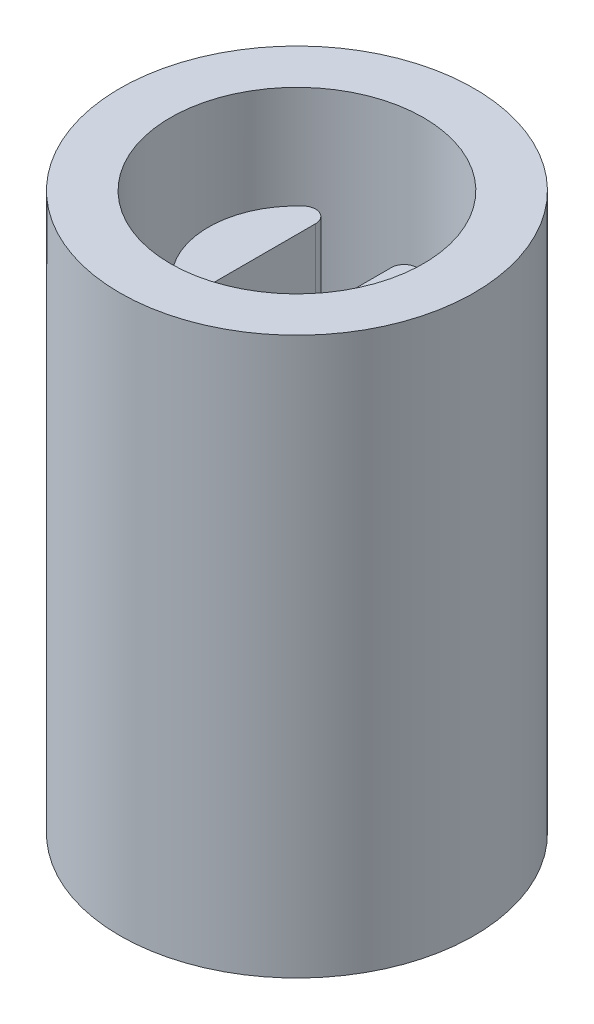
ISO-10303-21;
HEADER;
FILE_DESCRIPTION(('STEP AP214'),'2;1');
FILE_NAME('part.step','',(''),(''),'','','');
FILE_SCHEMA(('AUTOMOTIVE_DESIGN { 1 0 10303 214 1 1 1 1 }'));
ENDSEC;
DATA;
#1=APPLICATION_CONTEXT('core data for automotive mechanical design processes');
#2=APPLICATION_PROTOCOL_DEFINITION('international standard','automotive_design',2000,#1);
#3=PRODUCT_CONTEXT('',#1,'mechanical');
#4=PRODUCT('Part','Part','',(#3));
#5=PRODUCT_RELATED_PRODUCT_CATEGORY('part','',(#4));
#6=PRODUCT_DEFINITION_FORMATION('','',#4);
#7=PRODUCT_DEFINITION_CONTEXT('part definition',#1,'design');
#8=PRODUCT_DEFINITION('design','',#6,#7);
#9=PRODUCT_DEFINITION_SHAPE('','',#8);
#10=(LENGTH_UNIT() NAMED_UNIT(*) SI_UNIT(.MILLI.,.METRE.));
#11=(NAMED_UNIT(*) PLANE_ANGLE_UNIT() SI_UNIT($,.RADIAN.));
#12=(NAMED_UNIT(*) SI_UNIT($,.STERADIAN.) SOLID_ANGLE_UNIT());
#13=UNCERTAINTY_MEASURE_WITH_UNIT(LENGTH_MEASURE(1.E-05),#10,'distance_accuracy_value','');
#14=(GEOMETRIC_REPRESENTATION_CONTEXT(3) GLOBAL_UNCERTAINTY_ASSIGNED_CONTEXT((#13)) GLOBAL_UNIT_ASSIGNED_CONTEXT((#10,
#11,#12)) REPRESENTATION_CONTEXT('',''));
#15=CARTESIAN_POINT('',(0.,0.,0.));
#16=DIRECTION('',(0.,0.,1.));
#17=DIRECTION('',(1.,0.,0.));
#18=AXIS2_PLACEMENT_3D('',#15,#16,#17);
#19=CARTESIAN_POINT('',(0.,22.,0.));
#20=DIRECTION('',(0.,-1.,0.));
#21=DIRECTION('',(0.,0.,-1.));
#22=AXIS2_PLACEMENT_3D('',#19,#20,#21);
#23=CYLINDRICAL_SURFACE('',#22,7.);
#24=CARTESIAN_POINT('',(0.,22.,0.));
#25=DIRECTION('',(0.,1.,0.));
#26=DIRECTION('',(0.,0.,1.));
#27=AXIS2_PLACEMENT_3D('',#24,#25,#26);
#28=CIRCLE('',#27,7.);
#29=CARTESIAN_POINT('',(0.,22.,7.));
#30=VERTEX_POINT('',#29);
#31=EDGE_CURVE('E11',#30,#30,#28,.T.);
#32=ORIENTED_EDGE('',*,*,#31,.F.);
#33=EDGE_LOOP('',(#32));
#34=FACE_BOUND('',#33,.T.);
#35=CARTESIAN_POINT('',(0.,0.,0.));
#36=DIRECTION('',(0.,1.,0.));
#37=DIRECTION('',(0.,0.,1.));
#38=AXIS2_PLACEMENT_3D('',#35,#36,#37);
#39=CIRCLE('',#38,7.);
#40=CARTESIAN_POINT('',(0.,0.,7.));
#41=VERTEX_POINT('',#40);
#42=EDGE_CURVE('E47',#41,#41,#39,.T.);
#43=ORIENTED_EDGE('',*,*,#42,.T.);
#44=EDGE_LOOP('',(#43));
#45=FACE_BOUND('',#44,.T.);
#46=ADVANCED_FACE('F44',(#34,#45),#23,.T.);
#47=CARTESIAN_POINT('',(0.,22.,0.));
#48=DIRECTION('',(0.,1.,0.));
#49=DIRECTION('',(0.,0.,1.));
#50=AXIS2_PLACEMENT_3D('',#47,#48,#49);
#51=PLANE('',#50);
#52=CARTESIAN_POINT('',(0.,22.,0.));
#53=DIRECTION('',(0.,1.,0.));
#54=DIRECTION('',(0.,0.,1.));
#55=AXIS2_PLACEMENT_3D('',#52,#53,#54);
#56=CIRCLE('',#55,5.);
#57=CARTESIAN_POINT('',(0.,22.,5.));
#58=VERTEX_POINT('',#57);
#59=EDGE_CURVE('E389',#58,#58,#56,.T.);
#60=ORIENTED_EDGE('',*,*,#59,.F.);
#61=EDGE_LOOP('',(#60));
#62=FACE_BOUND('',#61,.T.);
#63=ORIENTED_EDGE('',*,*,#31,.T.);
#64=EDGE_LOOP('',(#63));
#65=FACE_BOUND('',#64,.T.);
#66=ADVANCED_FACE('F176',(#62,#65),#51,.T.);
#67=CARTESIAN_POINT('',(0.,0.,0.));
#68=DIRECTION('',(0.,1.,0.));
#69=DIRECTION('',(0.,0.,1.));
#70=AXIS2_PLACEMENT_3D('',#67,#68,#69);
#71=PLANE('',#70);
#72=CARTESIAN_POINT('',(0.,0.,0.));
#73=DIRECTION('',(0.,1.,0.));
#74=DIRECTION('',(0.,0.,1.));
#75=AXIS2_PLACEMENT_3D('',#72,#73,#74);
#76=CIRCLE('',#75,0.5);
#77=CARTESIAN_POINT('',(0.,0.,0.5));
#78=VERTEX_POINT('',#77);
#79=EDGE_CURVE('E412',#78,#78,#76,.T.);
#80=ORIENTED_EDGE('',*,*,#79,.T.);
#81=EDGE_LOOP('',(#80));
#82=FACE_BOUND('',#81,.T.);
#83=ORIENTED_EDGE('',*,*,#42,.F.);
#84=EDGE_LOOP('',(#83));
#85=FACE_BOUND('',#84,.T.);
#86=ADVANCED_FACE('F173',(#82,#85),#71,.F.);
#87=CARTESIAN_POINT('',(0.,19.,0.));
#88=DIRECTION('',(0.,-1.,0.));
#89=DIRECTION('',(0.,0.,-1.));
#90=AXIS2_PLACEMENT_3D('',#87,#88,#89);
#91=CYLINDRICAL_SURFACE('',#90,5.);
#92=CARTESIAN_POINT('',(0.,2.,0.));
#93=DIRECTION('',(0.,-1.,0.));
#94=DIRECTION('',(0.,0.,-1.));
#95=AXIS2_PLACEMENT_3D('',#92,#93,#94);
#96=CIRCLE('',#95,5.);
#97=CARTESIAN_POINT('',(0.,2.,-5.));
#98=VERTEX_POINT('',#97);
#99=EDGE_CURVE('E379',#98,#98,#96,.T.);
#100=ORIENTED_EDGE('',*,*,#99,.T.);
#101=EDGE_LOOP('',(#100));
#102=FACE_BOUND('',#101,.T.);
#103=ORIENTED_EDGE('',*,*,#59,.T.);
#104=EDGE_LOOP('',(#103));
#105=FACE_BOUND('',#104,.T.);
#106=ADVANCED_FACE('F175',(#102,#105),#91,.F.);
#107=CARTESIAN_POINT('',(2.,19.,-2.23606797749979));
#108=DIRECTION('',(0.,-1.,0.));
#109=DIRECTION('',(0.,0.,-1.));
#110=AXIS2_PLACEMENT_3D('',#107,#108,#109);
#111=CYLINDRICAL_SURFACE('',#110,0.5);
#112=CARTESIAN_POINT('',(2.,4.,-2.23606797749979));
#113=DIRECTION('',(0.,1.,0.));
#114=DIRECTION('',(0.,0.,1.));
#115=AXIS2_PLACEMENT_3D('',#112,#113,#114);
#116=CIRCLE('',#115,0.5);
#117=CARTESIAN_POINT('',(2.33333333333333,4.,-2.60874597374976));
#118=VERTEX_POINT('',#117);
#119=CARTESIAN_POINT('',(1.5,4.,-2.23606797749979));
#120=VERTEX_POINT('',#119);
#121=EDGE_CURVE('E132',#118,#120,#116,.T.);
#122=ORIENTED_EDGE('',*,*,#121,.T.);
#123=DIRECTION('',(0.,-1.,0.));
#124=VECTOR('',#123,1.);
#125=CARTESIAN_POINT('',(1.5,19.,-2.23606797749979));
#126=LINE('',#125,#124);
#127=CARTESIAN_POINT('',(1.5,19.,-2.23606797749979));
#128=VERTEX_POINT('',#127);
#129=EDGE_CURVE('E165',#128,#120,#126,.T.);
#130=ORIENTED_EDGE('',*,*,#129,.F.);
#131=CARTESIAN_POINT('',(2.,19.,-2.23606797749979));
#132=DIRECTION('',(0.,1.,0.));
#133=DIRECTION('',(0.,0.,1.));
#134=AXIS2_PLACEMENT_3D('',#131,#132,#133);
#135=CIRCLE('',#134,0.5);
#136=CARTESIAN_POINT('',(2.33333333333333,19.,-2.60874597374976));
#137=VERTEX_POINT('',#136);
#138=EDGE_CURVE('E138',#137,#128,#135,.T.);
#139=ORIENTED_EDGE('',*,*,#138,.F.);
#140=DIRECTION('',(0.,-1.,0.));
#141=VECTOR('',#140,1.);
#142=CARTESIAN_POINT('',(2.33333333333333,19.,-2.60874597374976));
#143=LINE('',#142,#141);
#144=EDGE_CURVE('E149',#137,#118,#143,.T.);
#145=ORIENTED_EDGE('',*,*,#144,.T.);
#146=EDGE_LOOP('',(#122,#130,#139,#145));
#147=FACE_BOUND('',#146,.T.);
#148=ADVANCED_FACE('F183',(#147),#111,.T.);
#149=CARTESIAN_POINT('',(1.5,19.,2.23606797749979));
#150=DIRECTION('',(1.,0.,0.));
#151=DIRECTION('',(0.,0.,-1.));
#152=AXIS2_PLACEMENT_3D('',#149,#150,#151);
#153=PLANE('',#152);
#154=DIRECTION('',(0.,0.,1.));
#155=VECTOR('',#154,1.);
#156=CARTESIAN_POINT('',(1.5,4.,2.23606797749979));
#157=LINE('',#156,#155);
#158=CARTESIAN_POINT('',(1.5,4.,2.23606797749979));
#159=VERTEX_POINT('',#158);
#160=EDGE_CURVE('E152',#120,#159,#157,.T.);
#161=ORIENTED_EDGE('',*,*,#160,.T.);
#162=DIRECTION('',(0.,-1.,0.));
#163=VECTOR('',#162,1.);
#164=CARTESIAN_POINT('',(1.5,19.,2.23606797749979));
#165=LINE('',#164,#163);
#166=CARTESIAN_POINT('',(1.5,19.,2.23606797749979));
#167=VERTEX_POINT('',#166);
#168=EDGE_CURVE('E163',#167,#159,#165,.T.);
#169=ORIENTED_EDGE('',*,*,#168,.F.);
#170=DIRECTION('',(0.,0.,1.));
#171=VECTOR('',#170,1.);
#172=CARTESIAN_POINT('',(1.5,19.,2.23606797749979));
#173=LINE('',#172,#171);
#174=EDGE_CURVE('E141',#128,#167,#173,.T.);
#175=ORIENTED_EDGE('',*,*,#174,.F.);
#176=ORIENTED_EDGE('',*,*,#129,.T.);
#177=EDGE_LOOP('',(#161,#169,#175,#176));
#178=FACE_BOUND('',#177,.T.);
#179=ADVANCED_FACE('F213',(#178),#153,.F.);
#180=CARTESIAN_POINT('',(2.,19.,2.23606797749979));
#181=DIRECTION('',(0.,-1.,0.));
#182=DIRECTION('',(0.,0.,-1.));
#183=AXIS2_PLACEMENT_3D('',#180,#181,#182);
#184=CYLINDRICAL_SURFACE('',#183,0.5);
#185=CARTESIAN_POINT('',(2.,4.,2.23606797749979));
#186=DIRECTION('',(0.,1.,0.));
#187=DIRECTION('',(0.,0.,-1.));
#188=AXIS2_PLACEMENT_3D('',#185,#186,#187);
#189=CIRCLE('',#188,0.5);
#190=CARTESIAN_POINT('',(2.33333333333333,4.,2.60874597374976));
#191=VERTEX_POINT('',#190);
#192=EDGE_CURVE('E155',#159,#191,#189,.T.);
#193=ORIENTED_EDGE('',*,*,#192,.T.);
#194=DIRECTION('',(0.,-1.,0.));
#195=VECTOR('',#194,1.);
#196=CARTESIAN_POINT('',(2.33333333333333,19.,2.60874597374976));
#197=LINE('',#196,#195);
#198=CARTESIAN_POINT('',(2.33333333333333,19.,2.60874597374976));
#199=VERTEX_POINT('',#198);
#200=EDGE_CURVE('E161',#199,#191,#197,.T.);
#201=ORIENTED_EDGE('',*,*,#200,.F.);
#202=CARTESIAN_POINT('',(2.,19.,2.23606797749979));
#203=DIRECTION('',(0.,1.,0.));
#204=DIRECTION('',(0.,0.,-1.));
#205=AXIS2_PLACEMENT_3D('',#202,#203,#204);
#206=CIRCLE('',#205,0.5);
#207=EDGE_CURVE('E145',#167,#199,#206,.T.);
#208=ORIENTED_EDGE('',*,*,#207,.F.);
#209=ORIENTED_EDGE('',*,*,#168,.T.);
#210=EDGE_LOOP('',(#193,#201,#208,#209));
#211=FACE_BOUND('',#210,.T.);
#212=ADVANCED_FACE('F222',(#211),#184,.T.);
#213=CARTESIAN_POINT('',(0.,19.,0.));
#214=DIRECTION('',(0.,-1.,0.));
#215=DIRECTION('',(0.,0.,-1.));
#216=AXIS2_PLACEMENT_3D('',#213,#214,#215);
#217=CYLINDRICAL_SURFACE('',#216,3.5);
#218=CARTESIAN_POINT('',(0.,4.,0.));
#219=DIRECTION('',(0.,1.,0.));
#220=DIRECTION('',(0.,0.,1.));
#221=AXIS2_PLACEMENT_3D('',#218,#219,#220);
#222=CIRCLE('',#221,3.5);
#223=EDGE_CURVE('E142',#191,#118,#222,.T.);
#224=ORIENTED_EDGE('',*,*,#223,.T.);
#225=ORIENTED_EDGE('',*,*,#144,.F.);
#226=CARTESIAN_POINT('',(0.,19.,0.));
#227=DIRECTION('',(0.,1.,0.));
#228=DIRECTION('',(0.,0.,1.));
#229=AXIS2_PLACEMENT_3D('',#226,#227,#228);
#230=CIRCLE('',#229,3.5);
#231=EDGE_CURVE('E66',#199,#137,#230,.T.);
#232=ORIENTED_EDGE('',*,*,#231,.F.);
#233=ORIENTED_EDGE('',*,*,#200,.T.);
#234=EDGE_LOOP('',(#224,#225,#232,#233));
#235=FACE_BOUND('',#234,.T.);
#236=ADVANCED_FACE('F230',(#235),#217,.T.);
#237=CARTESIAN_POINT('',(-2.,19.,2.23606797749979));
#238=DIRECTION('',(0.,-1.,0.));
#239=DIRECTION('',(0.,0.,-1.));
#240=AXIS2_PLACEMENT_3D('',#237,#238,#239);
#241=CYLINDRICAL_SURFACE('',#240,0.5);
#242=CARTESIAN_POINT('',(-2.,4.,2.23606797749979));
#243=DIRECTION('',(0.,1.,0.));
#244=DIRECTION('',(0.,0.,-1.));
#245=AXIS2_PLACEMENT_3D('',#242,#243,#244);
#246=CIRCLE('',#245,0.5);
#247=CARTESIAN_POINT('',(-2.33333333333333,4.,2.60874597374976));
#248=VERTEX_POINT('',#247);
#249=CARTESIAN_POINT('',(-1.5,4.,2.23606797749979));
#250=VERTEX_POINT('',#249);
#251=EDGE_CURVE('E396',#248,#250,#246,.T.);
#252=ORIENTED_EDGE('',*,*,#251,.T.);
#253=DIRECTION('',(0.,-1.,0.));
#254=VECTOR('',#253,1.);
#255=CARTESIAN_POINT('',(-1.5,19.,2.23606797749979));
#256=LINE('',#255,#254);
#257=CARTESIAN_POINT('',(-1.5,19.,2.23606797749979));
#258=VERTEX_POINT('',#257);
#259=EDGE_CURVE('E130',#258,#250,#256,.T.);
#260=ORIENTED_EDGE('',*,*,#259,.F.);
#261=CARTESIAN_POINT('',(-2.,19.,2.23606797749979));
#262=DIRECTION('',(0.,1.,0.));
#263=DIRECTION('',(0.,0.,-1.));
#264=AXIS2_PLACEMENT_3D('',#261,#262,#263);
#265=CIRCLE('',#264,0.5);
#266=CARTESIAN_POINT('',(-2.33333333333333,19.,2.60874597374976));
#267=VERTEX_POINT('',#266);
#268=EDGE_CURVE('E122',#267,#258,#265,.T.);
#269=ORIENTED_EDGE('',*,*,#268,.F.);
#270=DIRECTION('',(0.,-1.,0.));
#271=VECTOR('',#270,1.);
#272=CARTESIAN_POINT('',(-2.33333333333333,19.,2.60874597374976));
#273=LINE('',#272,#271);
#274=EDGE_CURVE('E134',#267,#248,#273,.T.);
#275=ORIENTED_EDGE('',*,*,#274,.T.);
#276=EDGE_LOOP('',(#252,#260,#269,#275));
#277=FACE_BOUND('',#276,.T.);
#278=ADVANCED_FACE('F239',(#277),#241,.T.);
#279=CARTESIAN_POINT('',(-1.5,19.,2.23606797749979));
#280=DIRECTION('',(-1.,0.,0.));
#281=DIRECTION('',(0.,0.,1.));
#282=AXIS2_PLACEMENT_3D('',#279,#280,#281);
#283=PLANE('',#282);
#284=DIRECTION('',(0.,0.,-1.));
#285=VECTOR('',#284,1.);
#286=CARTESIAN_POINT('',(-1.5,4.,2.23606797749979));
#287=LINE('',#286,#285);
#288=CARTESIAN_POINT('',(-1.5,4.,-2.23606797749979));
#289=VERTEX_POINT('',#288);
#290=EDGE_CURVE('E129',#250,#289,#287,.T.);
#291=ORIENTED_EDGE('',*,*,#290,.T.);
#292=DIRECTION('',(0.,-1.,0.));
#293=VECTOR('',#292,1.);
#294=CARTESIAN_POINT('',(-1.5,19.,-2.23606797749979));
#295=LINE('',#294,#293);
#296=CARTESIAN_POINT('',(-1.5,19.,-2.23606797749979));
#297=VERTEX_POINT('',#296);
#298=EDGE_CURVE('E114',#297,#289,#295,.T.);
#299=ORIENTED_EDGE('',*,*,#298,.F.);
#300=DIRECTION('',(0.,0.,-1.));
#301=VECTOR('',#300,1.);
#302=CARTESIAN_POINT('',(-1.5,19.,2.23606797749979));
#303=LINE('',#302,#301);
#304=EDGE_CURVE('E118',#258,#297,#303,.T.);
#305=ORIENTED_EDGE('',*,*,#304,.F.);
#306=ORIENTED_EDGE('',*,*,#259,.T.);
#307=EDGE_LOOP('',(#291,#299,#305,#306));
#308=FACE_BOUND('',#307,.T.);
#309=ADVANCED_FACE('F128',(#308),#283,.F.);
#310=CARTESIAN_POINT('',(-2.,19.,-2.23606797749979));
#311=DIRECTION('',(0.,-1.,0.));
#312=DIRECTION('',(0.,0.,-1.));
#313=AXIS2_PLACEMENT_3D('',#310,#311,#312);
#314=CYLINDRICAL_SURFACE('',#313,0.5);
#315=CARTESIAN_POINT('',(-2.,4.,-2.23606797749979));
#316=DIRECTION('',(0.,1.,0.));
#317=DIRECTION('',(0.,0.,1.));
#318=AXIS2_PLACEMENT_3D('',#315,#316,#317);
#319=CIRCLE('',#318,0.5);
#320=CARTESIAN_POINT('',(-2.33333333333333,4.,-2.60874597374976));
#321=VERTEX_POINT('',#320);
#322=EDGE_CURVE('E403',#289,#321,#319,.T.);
#323=ORIENTED_EDGE('',*,*,#322,.T.);
#324=DIRECTION('',(0.,-1.,0.));
#325=VECTOR('',#324,1.);
#326=CARTESIAN_POINT('',(-2.33333333333333,19.,-2.60874597374976));
#327=LINE('',#326,#325);
#328=CARTESIAN_POINT('',(-2.33333333333333,19.,-2.60874597374976));
#329=VERTEX_POINT('',#328);
#330=EDGE_CURVE('E116',#329,#321,#327,.T.);
#331=ORIENTED_EDGE('',*,*,#330,.F.);
#332=CARTESIAN_POINT('',(-2.,19.,-2.23606797749979));
#333=DIRECTION('',(0.,1.,0.));
#334=DIRECTION('',(0.,0.,1.));
#335=AXIS2_PLACEMENT_3D('',#332,#333,#334);
#336=CIRCLE('',#335,0.5);
#337=EDGE_CURVE('E109',#297,#329,#336,.T.);
#338=ORIENTED_EDGE('',*,*,#337,.F.);
#339=ORIENTED_EDGE('',*,*,#298,.T.);
#340=EDGE_LOOP('',(#323,#331,#338,#339));
#341=FACE_BOUND('',#340,.T.);
#342=ADVANCED_FACE('F112',(#341),#314,.T.);
#343=CARTESIAN_POINT('',(0.,19.,0.));
#344=DIRECTION('',(0.,-1.,0.));
#345=DIRECTION('',(0.,0.,-1.));
#346=AXIS2_PLACEMENT_3D('',#343,#344,#345);
#347=CYLINDRICAL_SURFACE('',#346,3.5);
#348=CARTESIAN_POINT('',(0.,4.,0.));
#349=DIRECTION('',(0.,1.,0.));
#350=DIRECTION('',(0.,0.,1.));
#351=AXIS2_PLACEMENT_3D('',#348,#349,#350);
#352=CIRCLE('',#351,3.5);
#353=EDGE_CURVE('E397',#321,#248,#352,.T.);
#354=ORIENTED_EDGE('',*,*,#353,.T.);
#355=ORIENTED_EDGE('',*,*,#274,.F.);
#356=CARTESIAN_POINT('',(0.,19.,0.));
#357=DIRECTION('',(0.,1.,0.));
#358=DIRECTION('',(0.,0.,1.));
#359=AXIS2_PLACEMENT_3D('',#356,#357,#358);
#360=CIRCLE('',#359,3.5);
#361=EDGE_CURVE('E58',#329,#267,#360,.T.);
#362=ORIENTED_EDGE('',*,*,#361,.F.);
#363=ORIENTED_EDGE('',*,*,#330,.T.);
#364=EDGE_LOOP('',(#354,#355,#362,#363));
#365=FACE_BOUND('',#364,.T.);
#366=ADVANCED_FACE('F262',(#365),#347,.T.);
#367=CARTESIAN_POINT('',(0.,4.,0.));
#368=DIRECTION('',(0.,-1.,0.));
#369=DIRECTION('',(0.,0.,-1.));
#370=AXIS2_PLACEMENT_3D('',#367,#368,#369);
#371=PLANE('',#370);
#372=CARTESIAN_POINT('',(2.5,4.,0.));
#373=DIRECTION('',(0.,-1.,0.));
#374=DIRECTION('',(0.,0.,1.));
#375=AXIS2_PLACEMENT_3D('',#372,#373,#374);
#376=CIRCLE('',#375,0.8);
#377=CARTESIAN_POINT('',(2.5,4.,0.8));
#378=VERTEX_POINT('',#377);
#379=EDGE_CURVE('E384',#378,#378,#376,.T.);
#380=ORIENTED_EDGE('',*,*,#379,.F.);
#381=EDGE_LOOP('',(#380));
#382=FACE_BOUND('',#381,.T.);
#383=ORIENTED_EDGE('',*,*,#223,.F.);
#384=ORIENTED_EDGE('',*,*,#192,.F.);
#385=ORIENTED_EDGE('',*,*,#160,.F.);
#386=ORIENTED_EDGE('',*,*,#121,.F.);
#387=EDGE_LOOP('',(#383,#384,#385,#386));
#388=FACE_BOUND('',#387,.T.);
#389=ADVANCED_FACE('F270',(#382,#388),#371,.T.);
#390=CARTESIAN_POINT('',(-2.5,4.,0.));
#391=DIRECTION('',(0.,-1.,0.));
#392=DIRECTION('',(0.,0.,-1.));
#393=AXIS2_PLACEMENT_3D('',#390,#391,#392);
#394=CIRCLE('',#393,0.8);
#395=CARTESIAN_POINT('',(-2.5,4.,-0.8));
#396=VERTEX_POINT('',#395);
#397=EDGE_CURVE('E383',#396,#396,#394,.T.);
#398=ORIENTED_EDGE('',*,*,#397,.F.);
#399=EDGE_LOOP('',(#398));
#400=FACE_BOUND('',#399,.T.);
#401=ORIENTED_EDGE('',*,*,#353,.F.);
#402=ORIENTED_EDGE('',*,*,#322,.F.);
#403=ORIENTED_EDGE('',*,*,#290,.F.);
#404=ORIENTED_EDGE('',*,*,#251,.F.);
#405=EDGE_LOOP('',(#401,#402,#403,#404));
#406=FACE_BOUND('',#405,.T.);
#407=ADVANCED_FACE('F278',(#400,#406),#371,.T.);
#408=CARTESIAN_POINT('',(0.,2.,0.));
#409=DIRECTION('',(0.,-1.,0.));
#410=DIRECTION('',(0.,0.,-1.));
#411=AXIS2_PLACEMENT_3D('',#408,#409,#410);
#412=PLANE('',#411);
#413=CARTESIAN_POINT('',(0.,2.,0.));
#414=DIRECTION('',(0.,1.,0.));
#415=DIRECTION('',(0.,0.,1.));
#416=AXIS2_PLACEMENT_3D('',#413,#414,#415);
#417=CIRCLE('',#416,0.5);
#418=CARTESIAN_POINT('',(0.,2.,0.5));
#419=VERTEX_POINT('',#418);
#420=EDGE_CURVE('E371',#419,#419,#417,.T.);
#421=ORIENTED_EDGE('',*,*,#420,.F.);
#422=EDGE_LOOP('',(#421));
#423=FACE_BOUND('',#422,.T.);
#424=CARTESIAN_POINT('',(-2.5,2.,0.));
#425=DIRECTION('',(0.,-1.,0.));
#426=DIRECTION('',(0.,0.,-1.));
#427=AXIS2_PLACEMENT_3D('',#424,#425,#426);
#428=CIRCLE('',#427,0.8);
#429=CARTESIAN_POINT('',(-2.5,2.,-0.8));
#430=VERTEX_POINT('',#429);
#431=EDGE_CURVE('E375',#430,#430,#428,.T.);
#432=ORIENTED_EDGE('',*,*,#431,.T.);
#433=EDGE_LOOP('',(#432));
#434=FACE_BOUND('',#433,.T.);
#435=ORIENTED_EDGE('',*,*,#99,.F.);
#436=EDGE_LOOP('',(#435));
#437=FACE_BOUND('',#436,.T.);
#438=CARTESIAN_POINT('',(2.5,2.,0.));
#439=DIRECTION('',(0.,-1.,0.));
#440=DIRECTION('',(0.,0.,1.));
#441=AXIS2_PLACEMENT_3D('',#438,#439,#440);
#442=CIRCLE('',#441,0.8);
#443=CARTESIAN_POINT('',(2.5,2.,0.8));
#444=VERTEX_POINT('',#443);
#445=EDGE_CURVE('E382',#444,#444,#442,.T.);
#446=ORIENTED_EDGE('',*,*,#445,.T.);
#447=EDGE_LOOP('',(#446));
#448=FACE_BOUND('',#447,.T.);
#449=ADVANCED_FACE('F287',(#423,#434,#437,#448),#412,.F.);
#450=CARTESIAN_POINT('',(-2.5,2.,0.));
#451=DIRECTION('',(0.,1.,0.));
#452=DIRECTION('',(0.,0.,1.));
#453=AXIS2_PLACEMENT_3D('',#450,#451,#452);
#454=CYLINDRICAL_SURFACE('',#453,0.8);
#455=ORIENTED_EDGE('',*,*,#431,.F.);
#456=EDGE_LOOP('',(#455));
#457=FACE_BOUND('',#456,.T.);
#458=ORIENTED_EDGE('',*,*,#397,.T.);
#459=EDGE_LOOP('',(#458));
#460=FACE_BOUND('',#459,.T.);
#461=ADVANCED_FACE('F293',(#457,#460),#454,.T.);
#462=CARTESIAN_POINT('',(2.5,2.,0.));
#463=DIRECTION('',(0.,1.,0.));
#464=DIRECTION('',(0.,0.,1.));
#465=AXIS2_PLACEMENT_3D('',#462,#463,#464);
#466=CYLINDRICAL_SURFACE('',#465,0.8);
#467=ORIENTED_EDGE('',*,*,#445,.F.);
#468=EDGE_LOOP('',(#467));
#469=FACE_BOUND('',#468,.T.);
#470=ORIENTED_EDGE('',*,*,#379,.T.);
#471=EDGE_LOOP('',(#470));
#472=FACE_BOUND('',#471,.T.);
#473=ADVANCED_FACE('F297',(#469,#472),#466,.T.);
#474=CARTESIAN_POINT('',(0.,19.,0.));
#475=DIRECTION('',(0.,1.,0.));
#476=DIRECTION('',(0.,0.,1.));
#477=AXIS2_PLACEMENT_3D('',#474,#475,#476);
#478=PLANE('',#477);
#479=ORIENTED_EDGE('',*,*,#304,.T.);
#480=ORIENTED_EDGE('',*,*,#337,.T.);
#481=ORIENTED_EDGE('',*,*,#361,.T.);
#482=ORIENTED_EDGE('',*,*,#268,.T.);
#483=EDGE_LOOP('',(#479,#480,#481,#482));
#484=FACE_BOUND('',#483,.T.);
#485=ADVANCED_FACE('F121',(#484),#478,.T.);
#486=ORIENTED_EDGE('',*,*,#174,.T.);
#487=ORIENTED_EDGE('',*,*,#207,.T.);
#488=ORIENTED_EDGE('',*,*,#231,.T.);
#489=ORIENTED_EDGE('',*,*,#138,.T.);
#490=EDGE_LOOP('',(#486,#487,#488,#489));
#491=FACE_BOUND('',#490,.T.);
#492=ADVANCED_FACE('F313',(#491),#478,.T.);
#493=CARTESIAN_POINT('',(0.,0.,0.));
#494=DIRECTION('',(0.,1.,0.));
#495=DIRECTION('',(0.,0.,1.));
#496=AXIS2_PLACEMENT_3D('',#493,#494,#495);
#497=CYLINDRICAL_SURFACE('',#496,0.5);
#498=ORIENTED_EDGE('',*,*,#79,.F.);
#499=EDGE_LOOP('',(#498));
#500=FACE_BOUND('',#499,.T.);
#501=ORIENTED_EDGE('',*,*,#420,.T.);
#502=EDGE_LOOP('',(#501));
#503=FACE_BOUND('',#502,.T.);
#504=ADVANCED_FACE('F320',(#500,#503),#497,.F.);
#505=CLOSED_SHELL('',(#46,#66,#86,#106,#148,#179,#212,#236,#278,#309,#342,#366,#389,#407,#449,
#461,#473,#485,#492,#504));
#506=MANIFOLD_SOLID_BREP('B2',#505);
#507=ADVANCED_BREP_SHAPE_REPRESENTATION('',(#18,#506),#14);
#508=SHAPE_DEFINITION_REPRESENTATION(#9,#507);
ENDSEC;
END-ISO-10303-21;
